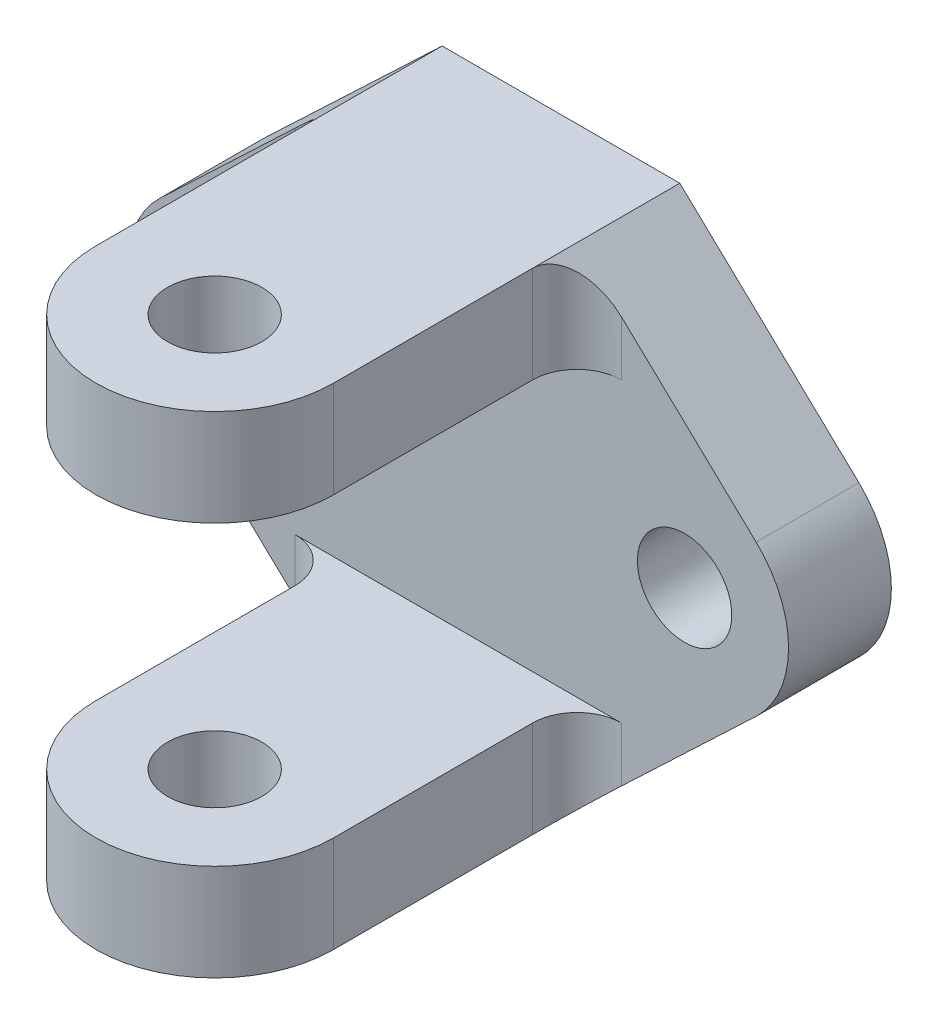
ISO-10303-21;
HEADER;
FILE_DESCRIPTION(('STEP AP214'),'2;1');
FILE_NAME('part.step','',(''),(''),'','','');
FILE_SCHEMA(('AUTOMOTIVE_DESIGN { 1 0 10303 214 1 1 1 1 }'));
ENDSEC;
DATA;
#1=APPLICATION_CONTEXT('core data for automotive mechanical design processes');
#2=APPLICATION_PROTOCOL_DEFINITION('international standard','automotive_design',2000,#1);
#3=PRODUCT_CONTEXT('',#1,'mechanical');
#4=PRODUCT('Part','Part','',(#3));
#5=PRODUCT_RELATED_PRODUCT_CATEGORY('part','',(#4));
#6=PRODUCT_DEFINITION_FORMATION('','',#4);
#7=PRODUCT_DEFINITION_CONTEXT('part definition',#1,'design');
#8=PRODUCT_DEFINITION('design','',#6,#7);
#9=PRODUCT_DEFINITION_SHAPE('','',#8);
#10=(LENGTH_UNIT() NAMED_UNIT(*) SI_UNIT(.MILLI.,.METRE.));
#11=(NAMED_UNIT(*) PLANE_ANGLE_UNIT() SI_UNIT($,.RADIAN.));
#12=(NAMED_UNIT(*) SI_UNIT($,.STERADIAN.) SOLID_ANGLE_UNIT());
#13=UNCERTAINTY_MEASURE_WITH_UNIT(LENGTH_MEASURE(1.E-05),#10,'distance_accuracy_value','');
#14=(GEOMETRIC_REPRESENTATION_CONTEXT(3) GLOBAL_UNCERTAINTY_ASSIGNED_CONTEXT((#13)) GLOBAL_UNIT_ASSIGNED_CONTEXT((#10,
#11,#12)) REPRESENTATION_CONTEXT('',''));
#15=CARTESIAN_POINT('',(0.,0.,0.));
#16=DIRECTION('',(0.,0.,1.));
#17=DIRECTION('',(1.,0.,0.));
#18=AXIS2_PLACEMENT_3D('',#15,#16,#17);
#19=CARTESIAN_POINT('',(-8.,-75.2900537937828,0.));
#20=DIRECTION('',(1.,0.,0.));
#21=DIRECTION('',(0.,0.,-1.));
#22=AXIS2_PLACEMENT_3D('',#19,#20,#21);
#23=PLANE('',#22);
#24=DIRECTION('',(0.,0.,1.));
#25=VECTOR('',#24,1.);
#26=CARTESIAN_POINT('',(-8.,16.51,0.));
#27=LINE('',#26,#25);
#28=CARTESIAN_POINT('',(-8.,16.51,12.46));
#29=VERTEX_POINT('',#28);
#30=CARTESIAN_POINT('',(-8.,16.51,25.8481308));
#31=VERTEX_POINT('',#30);
#32=EDGE_CURVE('E150',#29,#31,#27,.T.);
#33=ORIENTED_EDGE('',*,*,#32,.F.);
#34=DIRECTION('',(0.,1.,0.));
#35=VECTOR('',#34,1.);
#36=CARTESIAN_POINT('',(-8.,9.99999999999999,12.46));
#37=LINE('',#36,#35);
#38=CARTESIAN_POINT('',(-8.,10.,12.46));
#39=VERTEX_POINT('',#38);
#40=EDGE_CURVE('E143',#29,#39,#37,.F.);
#41=ORIENTED_EDGE('',*,*,#40,.T.);
#42=DIRECTION('',(0.,0.,-1.));
#43=VECTOR('',#42,1.);
#44=CARTESIAN_POINT('',(-7.99999999999999,10.,45.442));
#45=LINE('',#44,#43);
#46=CARTESIAN_POINT('',(-8.,9.99999999999999,25.8481308));
#47=VERTEX_POINT('',#46);
#48=EDGE_CURVE('E147',#47,#39,#45,.T.);
#49=ORIENTED_EDGE('',*,*,#48,.F.);
#50=DIRECTION('',(0.,1.,0.));
#51=VECTOR('',#50,1.);
#52=CARTESIAN_POINT('',(-8.,-75.2900537937828,25.8481308));
#53=LINE('',#52,#51);
#54=EDGE_CURVE('E296',#47,#31,#53,.T.);
#55=ORIENTED_EDGE('',*,*,#54,.T.);
#56=EDGE_LOOP('',(#33,#41,#49,#55));
#57=FACE_BOUND('',#56,.T.);
#58=ADVANCED_FACE('F43',(#57),#23,.F.);
#59=CARTESIAN_POINT('',(8.,-75.2900537937828,0.));
#60=DIRECTION('',(1.,0.,0.));
#61=DIRECTION('',(0.,0.,-1.));
#62=AXIS2_PLACEMENT_3D('',#59,#60,#61);
#63=PLANE('',#62);
#64=DIRECTION('',(0.,0.,-1.));
#65=VECTOR('',#64,1.);
#66=CARTESIAN_POINT('',(8.,10.,45.442));
#67=LINE('',#66,#65);
#68=CARTESIAN_POINT('',(8.,9.99999999999999,25.8481308));
#69=VERTEX_POINT('',#68);
#70=CARTESIAN_POINT('',(8.,10.,12.46));
#71=VERTEX_POINT('',#70);
#72=EDGE_CURVE('E166',#69,#71,#67,.T.);
#73=ORIENTED_EDGE('',*,*,#72,.T.);
#74=DIRECTION('',(0.,1.,0.));
#75=VECTOR('',#74,1.);
#76=CARTESIAN_POINT('',(8.,-75.2900537937828,12.46));
#77=LINE('',#76,#75);
#78=CARTESIAN_POINT('',(8.,16.51,12.46));
#79=VERTEX_POINT('',#78);
#80=EDGE_CURVE('E232',#71,#79,#77,.T.);
#81=ORIENTED_EDGE('',*,*,#80,.T.);
#82=DIRECTION('',(0.,0.,1.));
#83=VECTOR('',#82,1.);
#84=CARTESIAN_POINT('',(8.,16.51,0.));
#85=LINE('',#84,#83);
#86=CARTESIAN_POINT('',(8.,16.51,25.8481308));
#87=VERTEX_POINT('',#86);
#88=EDGE_CURVE('E293',#79,#87,#85,.T.);
#89=ORIENTED_EDGE('',*,*,#88,.T.);
#90=DIRECTION('',(0.,1.,0.));
#91=VECTOR('',#90,1.);
#92=CARTESIAN_POINT('',(8.,-75.2900537937828,25.8481308));
#93=LINE('',#92,#91);
#94=EDGE_CURVE('E309',#69,#87,#93,.T.);
#95=ORIENTED_EDGE('',*,*,#94,.F.);
#96=EDGE_LOOP('',(#73,#81,#89,#95));
#97=FACE_BOUND('',#96,.T.);
#98=ADVANCED_FACE('F376',(#97),#63,.T.);
#99=CARTESIAN_POINT('',(15.24,0.,45.8272655007219));
#100=DIRECTION('',(0.,0.,-1.));
#101=DIRECTION('',(-1.,0.,0.));
#102=AXIS2_PLACEMENT_3D('',#99,#100,#101);
#103=CYLINDRICAL_SURFACE('',#102,7.);
#104=CARTESIAN_POINT('',(15.24,0.,2.54));
#105=DIRECTION('',(0.,0.,1.));
#106=DIRECTION('',(1.,0.,0.));
#107=AXIS2_PLACEMENT_3D('',#104,#105,#106);
#108=CIRCLE('',#107,7.00000000000001);
#109=CARTESIAN_POINT('',(20.0561111284394,-5.07986944699585,2.54));
#110=VERTEX_POINT('',#109);
#111=CARTESIAN_POINT('',(20.0561111284394,5.07986944699585,2.54));
#112=VERTEX_POINT('',#111);
#113=EDGE_CURVE('E492',#110,#112,#108,.T.);
#114=ORIENTED_EDGE('',*,*,#113,.T.);
#115=DIRECTION('',(0.,0.,-1.));
#116=VECTOR('',#115,1.);
#117=CARTESIAN_POINT('',(20.0561111284394,5.07986944699585,26.0731785038264));
#118=LINE('',#117,#116);
#119=CARTESIAN_POINT('',(20.0561111284394,5.07986944699585,9.46));
#120=VERTEX_POINT('',#119);
#121=EDGE_CURVE('E209',#120,#112,#118,.T.);
#122=ORIENTED_EDGE('',*,*,#121,.F.);
#123=CARTESIAN_POINT('',(15.24,0.,9.46));
#124=DIRECTION('',(0.,0.,-1.));
#125=DIRECTION('',(-1.,0.,0.));
#126=AXIS2_PLACEMENT_3D('',#123,#124,#125);
#127=CIRCLE('',#126,7.);
#128=CARTESIAN_POINT('',(20.0561111284394,-5.07986944699585,9.46));
#129=VERTEX_POINT('',#128);
#130=EDGE_CURVE('E207',#129,#120,#127,.F.);
#131=ORIENTED_EDGE('',*,*,#130,.F.);
#132=DIRECTION('',(0.,0.,-1.));
#133=VECTOR('',#132,1.);
#134=CARTESIAN_POINT('',(20.0561111284394,-5.07986944699585,26.0731785038264));
#135=LINE('',#134,#133);
#136=EDGE_CURVE('E271',#129,#110,#135,.T.);
#137=ORIENTED_EDGE('',*,*,#136,.T.);
#138=EDGE_LOOP('',(#114,#122,#131,#137));
#139=FACE_BOUND('',#138,.T.);
#140=ADVANCED_FACE('F438',(#139),#103,.T.);
#141=DIRECTION('',(0.,0.,1.));
#142=VECTOR('',#141,1.);
#143=CARTESIAN_POINT('',(-7.99999999999999,-10.,45.442));
#144=LINE('',#143,#142);
#145=CARTESIAN_POINT('',(-8.,-10.,12.46));
#146=VERTEX_POINT('',#145);
#147=CARTESIAN_POINT('',(-8.,-10.,25.8481308));
#148=VERTEX_POINT('',#147);
#149=EDGE_CURVE('E244',#146,#148,#144,.T.);
#150=ORIENTED_EDGE('',*,*,#149,.F.);
#151=DIRECTION('',(0.,-1.,0.));
#152=VECTOR('',#151,1.);
#153=CARTESIAN_POINT('',(-8.,-16.51,12.46));
#154=LINE('',#153,#152);
#155=CARTESIAN_POINT('',(-8.,-16.51,12.46));
#156=VERTEX_POINT('',#155);
#157=EDGE_CURVE('E214',#146,#156,#154,.T.);
#158=ORIENTED_EDGE('',*,*,#157,.T.);
#159=DIRECTION('',(0.,0.,1.));
#160=VECTOR('',#159,1.);
#161=CARTESIAN_POINT('',(-8.,-16.51,0.));
#162=LINE('',#161,#160);
#163=CARTESIAN_POINT('',(-8.,-16.51,25.8481308));
#164=VERTEX_POINT('',#163);
#165=EDGE_CURVE('E304',#156,#164,#162,.T.);
#166=ORIENTED_EDGE('',*,*,#165,.T.);
#167=EDGE_CURVE('E255',#164,#148,#53,.T.);
#168=ORIENTED_EDGE('',*,*,#167,.T.);
#169=EDGE_LOOP('',(#150,#158,#166,#168));
#170=FACE_BOUND('',#169,.T.);
#171=ADVANCED_FACE('F251',(#170),#23,.F.);
#172=CARTESIAN_POINT('',(-15.24,0.,45.8272655007219));
#173=DIRECTION('',(0.,0.,-1.));
#174=DIRECTION('',(-1.,0.,0.));
#175=AXIS2_PLACEMENT_3D('',#172,#173,#174);
#176=CYLINDRICAL_SURFACE('',#175,7.);
#177=DIRECTION('',(0.,0.,-1.));
#178=VECTOR('',#177,1.);
#179=CARTESIAN_POINT('',(-20.0561111284394,5.07986944699585,26.0731785038264));
#180=LINE('',#179,#178);
#181=CARTESIAN_POINT('',(-20.0561111284394,5.07986944699585,9.46));
#182=VERTEX_POINT('',#181);
#183=CARTESIAN_POINT('',(-20.0561111284394,5.07986944699585,2.54));
#184=VERTEX_POINT('',#183);
#185=EDGE_CURVE('E210',#182,#184,#180,.T.);
#186=ORIENTED_EDGE('',*,*,#185,.T.);
#187=CARTESIAN_POINT('',(-15.24,0.,2.54));
#188=DIRECTION('',(0.,0.,1.));
#189=DIRECTION('',(1.,0.,0.));
#190=AXIS2_PLACEMENT_3D('',#187,#188,#189);
#191=CIRCLE('',#190,7.);
#192=CARTESIAN_POINT('',(-20.0561111284394,-5.07986944699585,2.54));
#193=VERTEX_POINT('',#192);
#194=EDGE_CURVE('E59',#184,#193,#191,.T.);
#195=ORIENTED_EDGE('',*,*,#194,.T.);
#196=DIRECTION('',(0.,0.,-1.));
#197=VECTOR('',#196,1.);
#198=CARTESIAN_POINT('',(-20.0561111284394,-5.07986944699585,26.0731785038264));
#199=LINE('',#198,#197);
#200=CARTESIAN_POINT('',(-20.0561111284394,-5.07986944699584,9.46));
#201=VERTEX_POINT('',#200);
#202=EDGE_CURVE('E112',#201,#193,#199,.T.);
#203=ORIENTED_EDGE('',*,*,#202,.F.);
#204=CARTESIAN_POINT('',(-15.24,0.,9.46));
#205=DIRECTION('',(0.,0.,-1.));
#206=DIRECTION('',(-1.,0.,0.));
#207=AXIS2_PLACEMENT_3D('',#204,#205,#206);
#208=CIRCLE('',#207,7.);
#209=EDGE_CURVE('E266',#201,#182,#208,.T.);
#210=ORIENTED_EDGE('',*,*,#209,.T.);
#211=EDGE_LOOP('',(#186,#195,#203,#210));
#212=FACE_BOUND('',#211,.T.);
#213=ADVANCED_FACE('F430',(#212),#176,.T.);
#214=DIRECTION('',(0.,0.,1.));
#215=VECTOR('',#214,1.);
#216=CARTESIAN_POINT('',(8.,-16.51,0.));
#217=LINE('',#216,#215);
#218=CARTESIAN_POINT('',(8.,-16.51,12.46));
#219=VERTEX_POINT('',#218);
#220=CARTESIAN_POINT('',(8.,-16.51,25.8481308));
#221=VERTEX_POINT('',#220);
#222=EDGE_CURVE('E300',#219,#221,#217,.T.);
#223=ORIENTED_EDGE('',*,*,#222,.F.);
#224=DIRECTION('',(0.,-1.,0.));
#225=VECTOR('',#224,1.);
#226=CARTESIAN_POINT('',(8.,-75.2900537937828,12.46));
#227=LINE('',#226,#225);
#228=CARTESIAN_POINT('',(8.,-9.99999999999999,12.46));
#229=VERTEX_POINT('',#228);
#230=EDGE_CURVE('E155',#219,#229,#227,.F.);
#231=ORIENTED_EDGE('',*,*,#230,.T.);
#232=DIRECTION('',(0.,0.,1.));
#233=VECTOR('',#232,1.);
#234=CARTESIAN_POINT('',(8.,-9.99999999999999,45.442));
#235=LINE('',#234,#233);
#236=CARTESIAN_POINT('',(8.,-9.99999999999999,25.8481308));
#237=VERTEX_POINT('',#236);
#238=EDGE_CURVE('E221',#229,#237,#235,.T.);
#239=ORIENTED_EDGE('',*,*,#238,.T.);
#240=EDGE_CURVE('E305',#221,#237,#93,.T.);
#241=ORIENTED_EDGE('',*,*,#240,.F.);
#242=EDGE_LOOP('',(#223,#231,#239,#241));
#243=FACE_BOUND('',#242,.T.);
#244=ADVANCED_FACE('F352',(#243),#63,.T.);
#245=CARTESIAN_POINT('',(-23.24,10.,45.442));
#246=DIRECTION('',(0.,1.,0.));
#247=DIRECTION('',(0.,0.,1.));
#248=AXIS2_PLACEMENT_3D('',#245,#246,#247);
#249=PLANE('',#248);
#250=CARTESIAN_POINT('',(0.,10.,25.8481308));
#251=DIRECTION('',(0.,1.,0.));
#252=DIRECTION('',(0.,0.,1.));
#253=AXIS2_PLACEMENT_3D('',#250,#251,#252);
#254=CIRCLE('',#253,3.175);
#255=CARTESIAN_POINT('',(0.,10.,29.0231308));
#256=VERTEX_POINT('',#255);
#257=EDGE_CURVE('E327',#256,#256,#254,.T.);
#258=ORIENTED_EDGE('',*,*,#257,.T.);
#259=EDGE_LOOP('',(#258));
#260=FACE_BOUND('',#259,.T.);
#261=ORIENTED_EDGE('',*,*,#72,.F.);
#262=CARTESIAN_POINT('',(0.,9.99999999999999,25.8481308));
#263=DIRECTION('',(0.,1.,0.));
#264=DIRECTION('',(0.,0.,1.));
#265=AXIS2_PLACEMENT_3D('',#262,#263,#264);
#266=CIRCLE('',#265,8.);
#267=EDGE_CURVE('E164',#47,#69,#266,.T.);
#268=ORIENTED_EDGE('',*,*,#267,.F.);
#269=ORIENTED_EDGE('',*,*,#48,.T.);
#270=CARTESIAN_POINT('',(-11.,10.,12.46));
#271=DIRECTION('',(0.,1.,0.));
#272=DIRECTION('',(0.,0.,1.));
#273=AXIS2_PLACEMENT_3D('',#270,#271,#272);
#274=CIRCLE('',#273,3.);
#275=CARTESIAN_POINT('',(-11.,10.,9.46));
#276=VERTEX_POINT('',#275);
#277=EDGE_CURVE('E161',#39,#276,#274,.T.);
#278=ORIENTED_EDGE('',*,*,#277,.T.);
#279=DIRECTION('',(1.,0.,0.));
#280=VECTOR('',#279,1.);
#281=CARTESIAN_POINT('',(-23.24,10.,9.46));
#282=LINE('',#281,#280);
#283=CARTESIAN_POINT('',(11.,10.,9.46));
#284=VERTEX_POINT('',#283);
#285=EDGE_CURVE('E333',#276,#284,#282,.T.);
#286=ORIENTED_EDGE('',*,*,#285,.T.);
#287=CARTESIAN_POINT('',(11.,9.99999999999999,12.46));
#288=DIRECTION('',(0.,1.,0.));
#289=DIRECTION('',(0.,0.,1.));
#290=AXIS2_PLACEMENT_3D('',#287,#288,#289);
#291=CIRCLE('',#290,3.);
#292=EDGE_CURVE('E11',#284,#71,#291,.T.);
#293=ORIENTED_EDGE('',*,*,#292,.T.);
#294=EDGE_LOOP('',(#261,#268,#269,#278,#286,#293));
#295=FACE_BOUND('',#294,.T.);
#296=ADVANCED_FACE('F160',(#260,#295),#249,.F.);
#297=CARTESIAN_POINT('',(-23.24,-10.,45.442));
#298=DIRECTION('',(0.,-1.,0.));
#299=DIRECTION('',(1.,0.,0.));
#300=AXIS2_PLACEMENT_3D('',#297,#298,#299);
#301=PLANE('',#300);
#302=CARTESIAN_POINT('',(0.,-9.99999999999999,25.8481308));
#303=DIRECTION('',(0.,-1.,0.));
#304=DIRECTION('',(1.,0.,0.));
#305=AXIS2_PLACEMENT_3D('',#302,#303,#304);
#306=CIRCLE('',#305,3.175);
#307=CARTESIAN_POINT('',(0.,-9.99999999999999,29.0231308));
#308=VERTEX_POINT('',#307);
#309=EDGE_CURVE('E326',#308,#308,#306,.T.);
#310=ORIENTED_EDGE('',*,*,#309,.T.);
#311=EDGE_LOOP('',(#310));
#312=FACE_BOUND('',#311,.T.);
#313=ORIENTED_EDGE('',*,*,#238,.F.);
#314=CARTESIAN_POINT('',(11.,-9.99999999999999,12.46));
#315=DIRECTION('',(0.,-1.,0.));
#316=DIRECTION('',(1.,0.,0.));
#317=AXIS2_PLACEMENT_3D('',#314,#315,#316);
#318=CIRCLE('',#317,3.);
#319=CARTESIAN_POINT('',(11.,-9.99999999999999,9.46));
#320=VERTEX_POINT('',#319);
#321=EDGE_CURVE('E178',#229,#320,#318,.T.);
#322=ORIENTED_EDGE('',*,*,#321,.T.);
#323=DIRECTION('',(-1.,0.,0.));
#324=VECTOR('',#323,1.);
#325=CARTESIAN_POINT('',(-23.24,-10.,9.46));
#326=LINE('',#325,#324);
#327=CARTESIAN_POINT('',(-11.,-10.,9.46));
#328=VERTEX_POINT('',#327);
#329=EDGE_CURVE('E246',#320,#328,#326,.T.);
#330=ORIENTED_EDGE('',*,*,#329,.T.);
#331=CARTESIAN_POINT('',(-11.,-9.99999999999999,12.46));
#332=DIRECTION('',(0.,-1.,0.));
#333=DIRECTION('',(1.,0.,0.));
#334=AXIS2_PLACEMENT_3D('',#331,#332,#333);
#335=CIRCLE('',#334,3.);
#336=EDGE_CURVE('E180',#328,#146,#335,.T.);
#337=ORIENTED_EDGE('',*,*,#336,.T.);
#338=ORIENTED_EDGE('',*,*,#149,.T.);
#339=CARTESIAN_POINT('',(0.,-9.99999999999998,25.8481308));
#340=DIRECTION('',(0.,-1.,0.));
#341=DIRECTION('',(1.,0.,0.));
#342=AXIS2_PLACEMENT_3D('',#339,#340,#341);
#343=CIRCLE('',#342,8.);
#344=EDGE_CURVE('E258',#237,#148,#343,.T.);
#345=ORIENTED_EDGE('',*,*,#344,.F.);
#346=EDGE_LOOP('',(#313,#322,#330,#337,#338,#345));
#347=FACE_BOUND('',#346,.T.);
#348=ADVANCED_FACE('F242',(#312,#347),#301,.F.);
#349=CARTESIAN_POINT('',(0.,0.,9.46));
#350=DIRECTION('',(0.,0.,-1.));
#351=DIRECTION('',(-1.,0.,0.));
#352=AXIS2_PLACEMENT_3D('',#349,#350,#351);
#353=PLANE('',#352);
#354=DIRECTION('',(0.725695635285122,-0.688015875491346,0.));
#355=VECTOR('',#354,1.);
#356=CARTESIAN_POINT('',(-12.030206605144,-12.6890508430442,9.46));
#357=LINE('',#356,#355);
#358=CARTESIAN_POINT('',(-11.,-13.6657667896637,9.46));
#359=VERTEX_POINT('',#358);
#360=EDGE_CURVE('E264',#201,#359,#357,.T.);
#361=ORIENTED_EDGE('',*,*,#360,.T.);
#362=DIRECTION('',(0.,-1.,0.));
#363=VECTOR('',#362,1.);
#364=CARTESIAN_POINT('',(-11.,-9.99999999999999,9.46));
#365=LINE('',#364,#363);
#366=EDGE_CURVE('E156',#359,#328,#365,.F.);
#367=ORIENTED_EDGE('',*,*,#366,.T.);
#368=ORIENTED_EDGE('',*,*,#329,.F.);
#369=DIRECTION('',(0.,-1.,0.));
#370=VECTOR('',#369,1.);
#371=CARTESIAN_POINT('',(11.,0.,9.46));
#372=LINE('',#371,#370);
#373=CARTESIAN_POINT('',(11.,-13.6657667896637,9.46));
#374=VERTEX_POINT('',#373);
#375=EDGE_CURVE('E213',#320,#374,#372,.T.);
#376=ORIENTED_EDGE('',*,*,#375,.T.);
#377=DIRECTION('',(-0.725695635285122,-0.688015875491346,0.));
#378=VECTOR('',#377,1.);
#379=CARTESIAN_POINT('',(12.030206605144,-12.6890508430442,9.46));
#380=LINE('',#379,#378);
#381=EDGE_CURVE('E275',#129,#374,#380,.T.);
#382=ORIENTED_EDGE('',*,*,#381,.F.);
#383=ORIENTED_EDGE('',*,*,#130,.T.);
#384=DIRECTION('',(-0.725695635285122,0.688015875491346,0.));
#385=VECTOR('',#384,1.);
#386=CARTESIAN_POINT('',(8.,16.51,9.46));
#387=LINE('',#386,#385);
#388=CARTESIAN_POINT('',(11.,13.6657667896637,9.46));
#389=VERTEX_POINT('',#388);
#390=EDGE_CURVE('E192',#120,#389,#387,.T.);
#391=ORIENTED_EDGE('',*,*,#390,.T.);
#392=DIRECTION('',(0.,1.,0.));
#393=VECTOR('',#392,1.);
#394=CARTESIAN_POINT('',(11.,0.,9.46));
#395=LINE('',#394,#393);
#396=EDGE_CURVE('E204',#389,#284,#395,.F.);
#397=ORIENTED_EDGE('',*,*,#396,.T.);
#398=ORIENTED_EDGE('',*,*,#285,.F.);
#399=DIRECTION('',(0.,1.,0.));
#400=VECTOR('',#399,1.);
#401=CARTESIAN_POINT('',(-11.,16.51,9.46));
#402=LINE('',#401,#400);
#403=CARTESIAN_POINT('',(-11.,13.6657667896637,9.46));
#404=VERTEX_POINT('',#403);
#405=EDGE_CURVE('E170',#276,#404,#402,.T.);
#406=ORIENTED_EDGE('',*,*,#405,.T.);
#407=DIRECTION('',(0.725695635285122,0.688015875491346,0.));
#408=VECTOR('',#407,1.);
#409=CARTESIAN_POINT('',(-8.,16.51,9.46));
#410=LINE('',#409,#408);
#411=EDGE_CURVE('E424',#182,#404,#410,.T.);
#412=ORIENTED_EDGE('',*,*,#411,.F.);
#413=ORIENTED_EDGE('',*,*,#209,.F.);
#414=EDGE_LOOP('',(#361,#367,#368,#376,#382,#383,#391,#397,#398,#406,#412,#413));
#415=FACE_BOUND('',#414,.T.);
#416=CARTESIAN_POINT('',(15.24,0.,9.46));
#417=DIRECTION('',(0.,0.,1.));
#418=DIRECTION('',(1.,0.,0.));
#419=AXIS2_PLACEMENT_3D('',#416,#417,#418);
#420=CIRCLE('',#419,3.175);
#421=CARTESIAN_POINT('',(18.415,0.,9.46));
#422=VERTEX_POINT('',#421);
#423=EDGE_CURVE('E259',#422,#422,#420,.T.);
#424=ORIENTED_EDGE('',*,*,#423,.F.);
#425=EDGE_LOOP('',(#424));
#426=FACE_BOUND('',#425,.T.);
#427=CARTESIAN_POINT('',(-15.24,0.,9.46));
#428=DIRECTION('',(0.,0.,1.));
#429=DIRECTION('',(1.,0.,0.));
#430=AXIS2_PLACEMENT_3D('',#427,#428,#429);
#431=CIRCLE('',#430,3.175);
#432=CARTESIAN_POINT('',(-12.065,0.,9.46));
#433=VERTEX_POINT('',#432);
#434=EDGE_CURVE('E336',#433,#433,#431,.T.);
#435=ORIENTED_EDGE('',*,*,#434,.F.);
#436=EDGE_LOOP('',(#435));
#437=FACE_BOUND('',#436,.T.);
#438=ADVANCED_FACE('F202',(#415,#426,#437),#353,.F.);
#439=CARTESIAN_POINT('',(-23.24,16.51,9.46));
#440=DIRECTION('',(0.,-1.,0.));
#441=DIRECTION('',(0.,0.,-1.));
#442=AXIS2_PLACEMENT_3D('',#439,#440,#441);
#443=PLANE('',#442);
#444=CARTESIAN_POINT('',(0.,16.51,25.8481308));
#445=DIRECTION('',(0.,-1.,0.));
#446=DIRECTION('',(0.,0.,-1.));
#447=AXIS2_PLACEMENT_3D('',#444,#445,#446);
#448=CIRCLE('',#447,3.175);
#449=CARTESIAN_POINT('',(0.,16.51,29.0231308));
#450=VERTEX_POINT('',#449);
#451=EDGE_CURVE('E318',#450,#450,#448,.T.);
#452=ORIENTED_EDGE('',*,*,#451,.T.);
#453=EDGE_LOOP('',(#452));
#454=FACE_BOUND('',#453,.T.);
#455=CARTESIAN_POINT('',(8.,16.51,2.54));
#456=VERTEX_POINT('',#455);
#457=EDGE_CURVE('E80',#456,#79,#85,.T.);
#458=ORIENTED_EDGE('',*,*,#457,.F.);
#459=DIRECTION('',(-1.,0.,0.));
#460=VECTOR('',#459,1.);
#461=CARTESIAN_POINT('',(8.,16.51,2.54));
#462=LINE('',#461,#460);
#463=CARTESIAN_POINT('',(-8.,16.51,2.54));
#464=VERTEX_POINT('',#463);
#465=EDGE_CURVE('E414',#456,#464,#462,.T.);
#466=ORIENTED_EDGE('',*,*,#465,.T.);
#467=EDGE_CURVE('E286',#464,#29,#27,.T.);
#468=ORIENTED_EDGE('',*,*,#467,.T.);
#469=ORIENTED_EDGE('',*,*,#32,.T.);
#470=CARTESIAN_POINT('',(0.,16.51,25.8481308));
#471=DIRECTION('',(0.,-1.,0.));
#472=DIRECTION('',(0.,0.,-1.));
#473=AXIS2_PLACEMENT_3D('',#470,#471,#472);
#474=CIRCLE('',#473,8.);
#475=EDGE_CURVE('E289',#87,#31,#474,.T.);
#476=ORIENTED_EDGE('',*,*,#475,.F.);
#477=ORIENTED_EDGE('',*,*,#88,.F.);
#478=EDGE_LOOP('',(#458,#466,#468,#469,#476,#477));
#479=FACE_BOUND('',#478,.T.);
#480=ADVANCED_FACE('F384',(#454,#479),#443,.F.);
#481=CARTESIAN_POINT('',(-23.24,-16.51,9.46));
#482=DIRECTION('',(0.,1.,0.));
#483=DIRECTION('',(0.,0.,1.));
#484=AXIS2_PLACEMENT_3D('',#481,#482,#483);
#485=PLANE('',#484);
#486=CARTESIAN_POINT('',(-8.,-16.51,2.54));
#487=VERTEX_POINT('',#486);
#488=EDGE_CURVE('E101',#487,#156,#162,.T.);
#489=ORIENTED_EDGE('',*,*,#488,.F.);
#490=DIRECTION('',(1.,0.,0.));
#491=VECTOR('',#490,1.);
#492=CARTESIAN_POINT('',(-8.,-16.51,2.54));
#493=LINE('',#492,#491);
#494=CARTESIAN_POINT('',(8.,-16.51,2.54));
#495=VERTEX_POINT('',#494);
#496=EDGE_CURVE('E755',#487,#495,#493,.T.);
#497=ORIENTED_EDGE('',*,*,#496,.T.);
#498=EDGE_CURVE('E68',#495,#219,#217,.T.);
#499=ORIENTED_EDGE('',*,*,#498,.T.);
#500=ORIENTED_EDGE('',*,*,#222,.T.);
#501=CARTESIAN_POINT('',(0.,-16.51,25.8481308));
#502=DIRECTION('',(0.,1.,0.));
#503=DIRECTION('',(0.,0.,1.));
#504=AXIS2_PLACEMENT_3D('',#501,#502,#503);
#505=CIRCLE('',#504,8.);
#506=EDGE_CURVE('E299',#221,#164,#505,.F.);
#507=ORIENTED_EDGE('',*,*,#506,.T.);
#508=ORIENTED_EDGE('',*,*,#165,.F.);
#509=EDGE_LOOP('',(#489,#497,#499,#500,#507,#508));
#510=FACE_BOUND('',#509,.T.);
#511=CARTESIAN_POINT('',(0.,-16.51,25.8481308));
#512=DIRECTION('',(0.,1.,0.));
#513=DIRECTION('',(0.,0.,1.));
#514=AXIS2_PLACEMENT_3D('',#511,#512,#513);
#515=CIRCLE('',#514,3.175);
#516=CARTESIAN_POINT('',(0.,-16.51,29.0231308));
#517=VERTEX_POINT('',#516);
#518=EDGE_CURVE('E322',#517,#517,#515,.F.);
#519=ORIENTED_EDGE('',*,*,#518,.F.);
#520=EDGE_LOOP('',(#519));
#521=FACE_BOUND('',#520,.T.);
#522=ADVANCED_FACE('F363',(#510,#521),#485,.F.);
#523=CARTESIAN_POINT('',(15.24,0.,9.46));
#524=DIRECTION('',(0.,0.,-1.));
#525=DIRECTION('',(-1.,0.,0.));
#526=AXIS2_PLACEMENT_3D('',#523,#524,#525);
#527=CYLINDRICAL_SURFACE('',#526,3.175);
#528=CARTESIAN_POINT('',(15.24,0.,2.54));
#529=DIRECTION('',(0.,0.,1.));
#530=DIRECTION('',(1.,0.,0.));
#531=AXIS2_PLACEMENT_3D('',#528,#529,#530);
#532=CIRCLE('',#531,3.175);
#533=CARTESIAN_POINT('',(18.415,0.,2.54));
#534=VERTEX_POINT('',#533);
#535=EDGE_CURVE('E426',#534,#534,#532,.T.);
#536=ORIENTED_EDGE('',*,*,#535,.F.);
#537=EDGE_LOOP('',(#536));
#538=FACE_BOUND('',#537,.T.);
#539=ORIENTED_EDGE('',*,*,#423,.T.);
#540=EDGE_LOOP('',(#539));
#541=FACE_BOUND('',#540,.T.);
#542=ADVANCED_FACE('F464',(#538,#541),#527,.F.);
#543=CARTESIAN_POINT('',(-15.24,0.,9.46));
#544=DIRECTION('',(0.,0.,-1.));
#545=DIRECTION('',(-1.,0.,0.));
#546=AXIS2_PLACEMENT_3D('',#543,#544,#545);
#547=CYLINDRICAL_SURFACE('',#546,3.175);
#548=CARTESIAN_POINT('',(-15.24,0.,2.54));
#549=DIRECTION('',(0.,0.,1.));
#550=DIRECTION('',(1.,0.,0.));
#551=AXIS2_PLACEMENT_3D('',#548,#549,#550);
#552=CIRCLE('',#551,3.175);
#553=CARTESIAN_POINT('',(-12.065,0.,2.54));
#554=VERTEX_POINT('',#553);
#555=EDGE_CURVE('E495',#554,#554,#552,.T.);
#556=ORIENTED_EDGE('',*,*,#555,.F.);
#557=EDGE_LOOP('',(#556));
#558=FACE_BOUND('',#557,.T.);
#559=ORIENTED_EDGE('',*,*,#434,.T.);
#560=EDGE_LOOP('',(#559));
#561=FACE_BOUND('',#560,.T.);
#562=ADVANCED_FACE('F461',(#558,#561),#547,.F.);
#563=CARTESIAN_POINT('',(0.,-25.4902561210691,25.8481308));
#564=DIRECTION('',(0.,1.,0.));
#565=DIRECTION('',(0.,0.,1.));
#566=AXIS2_PLACEMENT_3D('',#563,#564,#565);
#567=CYLINDRICAL_SURFACE('',#566,3.175);
#568=CARTESIAN_POINT('',(0.,-16.51,29.0231308));
#569=CARTESIAN_POINT('',(0.,-16.4421875,29.0231308));
#570=CARTESIAN_POINT('',(0.,-16.374375,29.0231308));
#571=CARTESIAN_POINT('',(0.,-16.23875,29.0231308));
#572=CARTESIAN_POINT('',(0.,-16.1709375,29.0231308));
#573=CARTESIAN_POINT('',(0.,-16.0353125,29.0231308));
#574=CARTESIAN_POINT('',(0.,-15.9675,29.0231308));
#575=CARTESIAN_POINT('',(0.,-15.831875,29.0231308));
#576=CARTESIAN_POINT('',(0.,-15.7640625,29.0231308));
#577=CARTESIAN_POINT('',(0.,-15.6284375,29.0231308));
#578=CARTESIAN_POINT('',(0.,-15.560625,29.0231308));
#579=CARTESIAN_POINT('',(0.,-15.425,29.0231308));
#580=CARTESIAN_POINT('',(0.,-15.3571875,29.0231308));
#581=CARTESIAN_POINT('',(0.,-15.2215625,29.0231308));
#582=CARTESIAN_POINT('',(0.,-15.15375,29.0231308));
#583=CARTESIAN_POINT('',(0.,-15.018125,29.0231308));
#584=CARTESIAN_POINT('',(0.,-14.9503125,29.0231308));
#585=CARTESIAN_POINT('',(0.,-14.8146875,29.0231308));
#586=CARTESIAN_POINT('',(0.,-14.746875,29.0231308));
#587=CARTESIAN_POINT('',(0.,-14.61125,29.0231308));
#588=CARTESIAN_POINT('',(0.,-14.5434375,29.0231308));
#589=CARTESIAN_POINT('',(0.,-14.4078125,29.0231308));
#590=CARTESIAN_POINT('',(0.,-14.34,29.0231308));
#591=CARTESIAN_POINT('',(0.,-14.204375,29.0231308));
#592=CARTESIAN_POINT('',(0.,-14.1365625,29.0231308));
#593=CARTESIAN_POINT('',(0.,-14.0009375,29.0231308));
#594=CARTESIAN_POINT('',(0.,-13.933125,29.0231308));
#595=CARTESIAN_POINT('',(0.,-13.7975,29.0231308));
#596=CARTESIAN_POINT('',(0.,-13.7296875,29.0231308));
#597=CARTESIAN_POINT('',(0.,-13.5940625,29.0231308));
#598=CARTESIAN_POINT('',(0.,-13.52625,29.0231308));
#599=CARTESIAN_POINT('',(0.,-13.390625,29.0231308));
#600=CARTESIAN_POINT('',(0.,-13.3228125,29.0231308));
#601=CARTESIAN_POINT('',(0.,-13.1871875,29.0231308));
#602=CARTESIAN_POINT('',(0.,-13.119375,29.0231308));
#603=CARTESIAN_POINT('',(0.,-12.98375,29.0231308));
#604=CARTESIAN_POINT('',(0.,-12.9159375,29.0231308));
#605=CARTESIAN_POINT('',(0.,-12.7803125,29.0231308));
#606=CARTESIAN_POINT('',(0.,-12.7125,29.0231308));
#607=CARTESIAN_POINT('',(0.,-12.576875,29.0231308));
#608=CARTESIAN_POINT('',(0.,-12.5090625,29.0231308));
#609=CARTESIAN_POINT('',(0.,-12.3734375,29.0231308));
#610=CARTESIAN_POINT('',(0.,-12.305625,29.0231308));
#611=CARTESIAN_POINT('',(0.,-12.17,29.0231308));
#612=CARTESIAN_POINT('',(0.,-12.1021875,29.0231308));
#613=CARTESIAN_POINT('',(0.,-11.9665625,29.0231308));
#614=CARTESIAN_POINT('',(0.,-11.89875,29.0231308));
#615=CARTESIAN_POINT('',(0.,-11.763125,29.0231308));
#616=CARTESIAN_POINT('',(0.,-11.6953125,29.0231308));
#617=CARTESIAN_POINT('',(0.,-11.5596875,29.0231308));
#618=CARTESIAN_POINT('',(0.,-11.491875,29.0231308));
#619=CARTESIAN_POINT('',(0.,-11.35625,29.0231308));
#620=CARTESIAN_POINT('',(0.,-11.2884375,29.0231308));
#621=CARTESIAN_POINT('',(0.,-11.1528125,29.0231308));
#622=CARTESIAN_POINT('',(0.,-11.085,29.0231308));
#623=CARTESIAN_POINT('',(0.,-10.949375,29.0231308));
#624=CARTESIAN_POINT('',(0.,-10.8815625,29.0231308));
#625=CARTESIAN_POINT('',(0.,-10.7459375,29.0231308));
#626=CARTESIAN_POINT('',(0.,-10.678125,29.0231308));
#627=CARTESIAN_POINT('',(0.,-10.5425,29.0231308));
#628=CARTESIAN_POINT('',(0.,-10.4746875,29.0231308));
#629=CARTESIAN_POINT('',(0.,-10.3390625,29.0231308));
#630=CARTESIAN_POINT('',(0.,-10.27125,29.0231308));
#631=CARTESIAN_POINT('',(0.,-10.135625,29.0231308));
#632=CARTESIAN_POINT('',(0.,-10.0678125,29.0231308));
#633=CARTESIAN_POINT('',(0.,-9.99999999999999,29.0231308));
#634=B_SPLINE_CURVE_WITH_KNOTS('',3,(#568,#569,#570,#571,#572,#573,#574,#575,#576,#577,#578,
#579,#580,#581,#582,#583,#584,#585,#586,#587,#588,#589,#590,#591,#592,#593,#594,#595,#596,#597,
#598,#599,#600,#601,#602,#603,#604,#605,#606,#607,#608,#609,#610,#611,#612,#613,#614,#615,#616,
#617,#618,#619,#620,#621,#622,#623,#624,#625,#626,#627,#628,#629,#630,#631,#632,#633),
.UNSPECIFIED.,.F.,.F.,(4,2,2,2,2,2,2,2,2,2,2,2,2,2,2,2,2,2,2,2,2,2,2,2,2,2,2,2,2,2,2,2,4),(0.,
0.2034375,0.406875000000001,0.610312500000001,0.813750000000002,1.0171875,1.220625,1.4240625,
1.6275,1.8309375,2.03437500000001,2.2378125,2.44125,2.6446875,2.84812500000001,3.05156250000001,
3.25500000000001,3.45843750000001,3.66187500000001,3.86531250000001,4.06875000000001,
4.27218750000001,4.47562500000001,4.67906250000001,4.88250000000001,5.08593750000001,
5.28937500000001,5.49281250000001,5.69625000000001,5.89968750000001,6.10312500000001,
6.30656250000001,6.51000000000001),.UNSPECIFIED.);
#635=EDGE_CURVE('BSEAM453',#517,#308,#634,.T.);
#636=ORIENTED_EDGE('',*,*,#518,.T.);
#637=ORIENTED_EDGE('',*,*,#309,.F.);
#638=ORIENTED_EDGE('',*,*,#635,.T.);
#639=ORIENTED_EDGE('',*,*,#635,.F.);
#640=EDGE_LOOP('',(#636,#638,#637,#639));
#641=FACE_BOUND('',#640,.T.);
#642=ADVANCED_FACE('F453',(#641),#567,.F.);
#643=CARTESIAN_POINT('',(0.,16.51,29.0231308));
#644=CARTESIAN_POINT('',(0.,16.4421875,29.0231308));
#645=CARTESIAN_POINT('',(0.,16.374375,29.0231308));
#646=CARTESIAN_POINT('',(0.,16.23875,29.0231308));
#647=CARTESIAN_POINT('',(0.,16.1709375,29.0231308));
#648=CARTESIAN_POINT('',(0.,16.0353125,29.0231308));
#649=CARTESIAN_POINT('',(0.,15.9675,29.0231308));
#650=CARTESIAN_POINT('',(0.,15.831875,29.0231308));
#651=CARTESIAN_POINT('',(0.,15.7640625,29.0231308));
#652=CARTESIAN_POINT('',(0.,15.6284375,29.0231308));
#653=CARTESIAN_POINT('',(0.,15.560625,29.0231308));
#654=CARTESIAN_POINT('',(0.,15.425,29.0231308));
#655=CARTESIAN_POINT('',(0.,15.3571875,29.0231308));
#656=CARTESIAN_POINT('',(0.,15.2215625,29.0231308));
#657=CARTESIAN_POINT('',(0.,15.15375,29.0231308));
#658=CARTESIAN_POINT('',(0.,15.018125,29.0231308));
#659=CARTESIAN_POINT('',(0.,14.9503125,29.0231308));
#660=CARTESIAN_POINT('',(0.,14.8146875,29.0231308));
#661=CARTESIAN_POINT('',(0.,14.746875,29.0231308));
#662=CARTESIAN_POINT('',(0.,14.61125,29.0231308));
#663=CARTESIAN_POINT('',(0.,14.5434375,29.0231308));
#664=CARTESIAN_POINT('',(0.,14.4078125,29.0231308));
#665=CARTESIAN_POINT('',(0.,14.34,29.0231308));
#666=CARTESIAN_POINT('',(0.,14.204375,29.0231308));
#667=CARTESIAN_POINT('',(0.,14.1365625,29.0231308));
#668=CARTESIAN_POINT('',(0.,14.0009375,29.0231308));
#669=CARTESIAN_POINT('',(0.,13.933125,29.0231308));
#670=CARTESIAN_POINT('',(0.,13.7975,29.0231308));
#671=CARTESIAN_POINT('',(0.,13.7296875,29.0231308));
#672=CARTESIAN_POINT('',(0.,13.5940625,29.0231308));
#673=CARTESIAN_POINT('',(0.,13.52625,29.0231308));
#674=CARTESIAN_POINT('',(0.,13.390625,29.0231308));
#675=CARTESIAN_POINT('',(0.,13.3228125,29.0231308));
#676=CARTESIAN_POINT('',(0.,13.1871875,29.0231308));
#677=CARTESIAN_POINT('',(0.,13.119375,29.0231308));
#678=CARTESIAN_POINT('',(0.,12.98375,29.0231308));
#679=CARTESIAN_POINT('',(0.,12.9159375,29.0231308));
#680=CARTESIAN_POINT('',(0.,12.7803125,29.0231308));
#681=CARTESIAN_POINT('',(0.,12.7125,29.0231308));
#682=CARTESIAN_POINT('',(0.,12.576875,29.0231308));
#683=CARTESIAN_POINT('',(0.,12.5090625,29.0231308));
#684=CARTESIAN_POINT('',(0.,12.3734375,29.0231308));
#685=CARTESIAN_POINT('',(0.,12.305625,29.0231308));
#686=CARTESIAN_POINT('',(0.,12.17,29.0231308));
#687=CARTESIAN_POINT('',(0.,12.1021875,29.0231308));
#688=CARTESIAN_POINT('',(0.,11.9665625,29.0231308));
#689=CARTESIAN_POINT('',(0.,11.89875,29.0231308));
#690=CARTESIAN_POINT('',(0.,11.763125,29.0231308));
#691=CARTESIAN_POINT('',(0.,11.6953125,29.0231308));
#692=CARTESIAN_POINT('',(0.,11.5596875,29.0231308));
#693=CARTESIAN_POINT('',(0.,11.491875,29.0231308));
#694=CARTESIAN_POINT('',(0.,11.35625,29.0231308));
#695=CARTESIAN_POINT('',(0.,11.2884375,29.0231308));
#696=CARTESIAN_POINT('',(0.,11.1528125,29.0231308));
#697=CARTESIAN_POINT('',(0.,11.085,29.0231308));
#698=CARTESIAN_POINT('',(0.,10.949375,29.0231308));
#699=CARTESIAN_POINT('',(0.,10.8815625,29.0231308));
#700=CARTESIAN_POINT('',(0.,10.7459375,29.0231308));
#701=CARTESIAN_POINT('',(0.,10.678125,29.0231308));
#702=CARTESIAN_POINT('',(0.,10.5425,29.0231308));
#703=CARTESIAN_POINT('',(0.,10.4746875,29.0231308));
#704=CARTESIAN_POINT('',(0.,10.3390625,29.0231308));
#705=CARTESIAN_POINT('',(0.,10.27125,29.0231308));
#706=CARTESIAN_POINT('',(0.,10.135625,29.0231308));
#707=CARTESIAN_POINT('',(0.,10.0678125,29.0231308));
#708=CARTESIAN_POINT('',(0.,10.,29.0231308));
#709=B_SPLINE_CURVE_WITH_KNOTS('',3,(#643,#644,#645,#646,#647,#648,#649,#650,#651,#652,#653,
#654,#655,#656,#657,#658,#659,#660,#661,#662,#663,#664,#665,#666,#667,#668,#669,#670,#671,#672,
#673,#674,#675,#676,#677,#678,#679,#680,#681,#682,#683,#684,#685,#686,#687,#688,#689,#690,#691,
#692,#693,#694,#695,#696,#697,#698,#699,#700,#701,#702,#703,#704,#705,#706,#707,#708),
.UNSPECIFIED.,.F.,.F.,(4,2,2,2,2,2,2,2,2,2,2,2,2,2,2,2,2,2,2,2,2,2,2,2,2,2,2,2,2,2,2,2,4),(0.,
0.2034375,0.406875000000001,0.610312500000001,0.813750000000002,1.0171875,1.220625,1.4240625,
1.6275,1.8309375,2.034375,2.2378125,2.44125,2.6446875,2.848125,3.0515625,3.255,3.4584375,
3.661875,3.8653125,4.06875,4.2721875,4.475625,4.6790625,4.8825,5.0859375,5.289375,5.4928125,
5.69625,5.8996875,6.103125,6.3065625,6.51),.UNSPECIFIED.);
#710=EDGE_CURVE('BSEAM450',#450,#256,#709,.T.);
#711=ORIENTED_EDGE('',*,*,#451,.F.);
#712=ORIENTED_EDGE('',*,*,#257,.F.);
#713=ORIENTED_EDGE('',*,*,#710,.T.);
#714=ORIENTED_EDGE('',*,*,#710,.F.);
#715=EDGE_LOOP('',(#711,#713,#712,#714));
#716=FACE_BOUND('',#715,.T.);
#717=ADVANCED_FACE('F450',(#716),#567,.F.);
#718=CARTESIAN_POINT('',(0.,-75.2900537937828,25.8481308));
#719=DIRECTION('',(0.,1.,0.));
#720=DIRECTION('',(0.,0.,1.));
#721=AXIS2_PLACEMENT_3D('',#718,#719,#720);
#722=CYLINDRICAL_SURFACE('',#721,8.);
#723=ORIENTED_EDGE('',*,*,#344,.T.);
#724=ORIENTED_EDGE('',*,*,#167,.F.);
#725=ORIENTED_EDGE('',*,*,#506,.F.);
#726=ORIENTED_EDGE('',*,*,#240,.T.);
#727=EDGE_LOOP('',(#723,#724,#725,#726));
#728=FACE_BOUND('',#727,.T.);
#729=ADVANCED_FACE('F359',(#728),#722,.T.);
#730=ORIENTED_EDGE('',*,*,#267,.T.);
#731=ORIENTED_EDGE('',*,*,#94,.T.);
#732=ORIENTED_EDGE('',*,*,#475,.T.);
#733=ORIENTED_EDGE('',*,*,#54,.F.);
#734=EDGE_LOOP('',(#730,#731,#732,#733));
#735=FACE_BOUND('',#734,.T.);
#736=ADVANCED_FACE('F371',(#735),#722,.T.);
#737=CARTESIAN_POINT('',(12.030206605144,-12.6890508430442,26.0731785038264));
#738=DIRECTION('',(-0.688015875491346,0.725695635285121,0.));
#739=DIRECTION('',(-0.725695635285122,-0.688015875491346,0.));
#740=AXIS2_PLACEMENT_3D('',#737,#738,#739);
#741=PLANE('',#740);
#742=ORIENTED_EDGE('',*,*,#498,.F.);
#743=DIRECTION('',(0.725695635285121,0.688015875491346,0.));
#744=VECTOR('',#743,1.);
#745=CARTESIAN_POINT('',(8.,-16.51,2.54));
#746=LINE('',#745,#744);
#747=EDGE_CURVE('E489',#495,#110,#746,.T.);
#748=ORIENTED_EDGE('',*,*,#747,.T.);
#749=ORIENTED_EDGE('',*,*,#136,.F.);
#750=ORIENTED_EDGE('',*,*,#381,.T.);
#751=CARTESIAN_POINT('',(11.,-13.6657667896637,12.46));
#752=DIRECTION('',(-0.688015875491346,0.725695635285121,0.));
#753=DIRECTION('',(-0.725695635285122,-0.688015875491346,0.));
#754=AXIS2_PLACEMENT_3D('',#751,#752,#753);
#755=ELLIPSE('',#754,4.13396450816645,3.);
#756=EDGE_CURVE('E172',#374,#219,#755,.T.);
#757=ORIENTED_EDGE('',*,*,#756,.T.);
#758=EDGE_LOOP('',(#742,#748,#749,#750,#757));
#759=FACE_BOUND('',#758,.T.);
#760=ADVANCED_FACE('F449',(#759),#741,.F.);
#761=CARTESIAN_POINT('',(-12.030206605144,-12.6890508430442,26.0731785038264));
#762=DIRECTION('',(-0.688015875491346,-0.725695635285122,0.));
#763=DIRECTION('',(0.725695635285122,-0.688015875491346,0.));
#764=AXIS2_PLACEMENT_3D('',#761,#762,#763);
#765=PLANE('',#764);
#766=DIRECTION('',(0.725695635285121,-0.688015875491347,0.));
#767=VECTOR('',#766,1.);
#768=CARTESIAN_POINT('',(-20.0561111284394,-5.07986944699585,2.54));
#769=LINE('',#768,#767);
#770=EDGE_CURVE('E758',#193,#487,#769,.T.);
#771=ORIENTED_EDGE('',*,*,#770,.T.);
#772=ORIENTED_EDGE('',*,*,#488,.T.);
#773=CARTESIAN_POINT('',(-11.,-13.6657667896637,12.46));
#774=DIRECTION('',(-0.688015875491346,-0.725695635285122,0.));
#775=DIRECTION('',(-0.725695635285122,0.688015875491346,0.));
#776=AXIS2_PLACEMENT_3D('',#773,#774,#775);
#777=ELLIPSE('',#776,4.13396450816645,3.);
#778=EDGE_CURVE('E235',#156,#359,#777,.F.);
#779=ORIENTED_EDGE('',*,*,#778,.T.);
#780=ORIENTED_EDGE('',*,*,#360,.F.);
#781=ORIENTED_EDGE('',*,*,#202,.T.);
#782=EDGE_LOOP('',(#771,#772,#779,#780,#781));
#783=FACE_BOUND('',#782,.T.);
#784=ADVANCED_FACE('F263',(#783),#765,.T.);
#785=CARTESIAN_POINT('',(8.,16.51,26.0731785038264));
#786=DIRECTION('',(0.688015875491346,0.725695635285122,0.));
#787=DIRECTION('',(-0.725695635285122,0.688015875491346,0.));
#788=AXIS2_PLACEMENT_3D('',#785,#786,#787);
#789=PLANE('',#788);
#790=DIRECTION('',(-0.725695635285122,0.688015875491346,0.));
#791=VECTOR('',#790,1.);
#792=CARTESIAN_POINT('',(20.0561111284394,5.07986944699585,2.54));
#793=LINE('',#792,#791);
#794=EDGE_CURVE('E493',#112,#456,#793,.T.);
#795=ORIENTED_EDGE('',*,*,#794,.T.);
#796=ORIENTED_EDGE('',*,*,#457,.T.);
#797=CARTESIAN_POINT('',(11.,13.6657667896637,12.46));
#798=DIRECTION('',(0.688015875491346,0.725695635285122,0.));
#799=DIRECTION('',(-0.725695635285122,0.688015875491346,0.));
#800=AXIS2_PLACEMENT_3D('',#797,#798,#799);
#801=ELLIPSE('',#800,4.13396450816645,3.);
#802=EDGE_CURVE('E52',#79,#389,#801,.F.);
#803=ORIENTED_EDGE('',*,*,#802,.T.);
#804=ORIENTED_EDGE('',*,*,#390,.F.);
#805=ORIENTED_EDGE('',*,*,#121,.T.);
#806=EDGE_LOOP('',(#795,#796,#803,#804,#805));
#807=FACE_BOUND('',#806,.T.);
#808=ADVANCED_FACE('F189',(#807),#789,.T.);
#809=CARTESIAN_POINT('',(-8.,16.51,26.0731785038264));
#810=DIRECTION('',(0.688015875491346,-0.725695635285122,0.));
#811=DIRECTION('',(0.725695635285122,0.688015875491346,0.));
#812=AXIS2_PLACEMENT_3D('',#809,#810,#811);
#813=PLANE('',#812);
#814=ORIENTED_EDGE('',*,*,#467,.F.);
#815=DIRECTION('',(-0.725695635285122,-0.688015875491346,0.));
#816=VECTOR('',#815,1.);
#817=CARTESIAN_POINT('',(-8.,16.51,2.54));
#818=LINE('',#817,#816);
#819=EDGE_CURVE('E412',#464,#184,#818,.T.);
#820=ORIENTED_EDGE('',*,*,#819,.T.);
#821=ORIENTED_EDGE('',*,*,#185,.F.);
#822=ORIENTED_EDGE('',*,*,#411,.T.);
#823=CARTESIAN_POINT('',(-11.,13.6657667896637,12.46));
#824=DIRECTION('',(0.688015875491346,-0.725695635285122,0.));
#825=DIRECTION('',(-0.725695635285122,-0.688015875491346,0.));
#826=AXIS2_PLACEMENT_3D('',#823,#824,#825);
#827=ELLIPSE('',#826,4.13396450816645,3.);
#828=EDGE_CURVE('E173',#404,#29,#827,.T.);
#829=ORIENTED_EDGE('',*,*,#828,.T.);
#830=EDGE_LOOP('',(#814,#820,#821,#822,#829));
#831=FACE_BOUND('',#830,.T.);
#832=ADVANCED_FACE('F422',(#831),#813,.F.);
#833=CARTESIAN_POINT('',(-11.,-75.2900537937828,12.46));
#834=DIRECTION('',(0.,1.,0.));
#835=DIRECTION('',(0.,0.,1.));
#836=AXIS2_PLACEMENT_3D('',#833,#834,#835);
#837=CYLINDRICAL_SURFACE('',#836,3.);
#838=ORIENTED_EDGE('',*,*,#336,.F.);
#839=ORIENTED_EDGE('',*,*,#366,.F.);
#840=ORIENTED_EDGE('',*,*,#778,.F.);
#841=ORIENTED_EDGE('',*,*,#157,.F.);
#842=EDGE_LOOP('',(#838,#839,#840,#841));
#843=FACE_BOUND('',#842,.T.);
#844=ADVANCED_FACE('F261',(#843),#837,.F.);
#845=CARTESIAN_POINT('',(-11.,0.,12.46));
#846=DIRECTION('',(0.,-1.,0.));
#847=DIRECTION('',(0.,0.,-1.));
#848=AXIS2_PLACEMENT_3D('',#845,#846,#847);
#849=CYLINDRICAL_SURFACE('',#848,3.);
#850=ORIENTED_EDGE('',*,*,#277,.F.);
#851=ORIENTED_EDGE('',*,*,#40,.F.);
#852=ORIENTED_EDGE('',*,*,#828,.F.);
#853=ORIENTED_EDGE('',*,*,#405,.F.);
#854=EDGE_LOOP('',(#850,#851,#852,#853));
#855=FACE_BOUND('',#854,.T.);
#856=ADVANCED_FACE('F168',(#855),#849,.F.);
#857=CARTESIAN_POINT('',(11.,0.,12.46));
#858=DIRECTION('',(0.,-1.,0.));
#859=DIRECTION('',(0.,0.,-1.));
#860=AXIS2_PLACEMENT_3D('',#857,#858,#859);
#861=CYLINDRICAL_SURFACE('',#860,3.);
#862=ORIENTED_EDGE('',*,*,#321,.F.);
#863=ORIENTED_EDGE('',*,*,#230,.F.);
#864=ORIENTED_EDGE('',*,*,#756,.F.);
#865=ORIENTED_EDGE('',*,*,#375,.F.);
#866=EDGE_LOOP('',(#862,#863,#864,#865));
#867=FACE_BOUND('',#866,.T.);
#868=ADVANCED_FACE('F479',(#867),#861,.F.);
#869=CARTESIAN_POINT('',(11.,-75.2900537937828,12.46));
#870=DIRECTION('',(0.,1.,0.));
#871=DIRECTION('',(0.,0.,1.));
#872=AXIS2_PLACEMENT_3D('',#869,#870,#871);
#873=CYLINDRICAL_SURFACE('',#872,3.);
#874=ORIENTED_EDGE('',*,*,#292,.F.);
#875=ORIENTED_EDGE('',*,*,#396,.F.);
#876=ORIENTED_EDGE('',*,*,#802,.F.);
#877=ORIENTED_EDGE('',*,*,#80,.F.);
#878=EDGE_LOOP('',(#874,#875,#876,#877));
#879=FACE_BOUND('',#878,.T.);
#880=ADVANCED_FACE('F45',(#879),#873,.F.);
#881=CARTESIAN_POINT('',(-15.24,0.,2.54));
#882=DIRECTION('',(0.,0.,1.));
#883=DIRECTION('',(1.,0.,0.));
#884=AXIS2_PLACEMENT_3D('',#881,#882,#883);
#885=PLANE('',#884);
#886=ORIENTED_EDGE('',*,*,#535,.T.);
#887=EDGE_LOOP('',(#886));
#888=FACE_BOUND('',#887,.T.);
#889=ORIENTED_EDGE('',*,*,#555,.T.);
#890=EDGE_LOOP('',(#889));
#891=FACE_BOUND('',#890,.T.);
#892=ORIENTED_EDGE('',*,*,#465,.F.);
#893=ORIENTED_EDGE('',*,*,#794,.F.);
#894=ORIENTED_EDGE('',*,*,#113,.F.);
#895=ORIENTED_EDGE('',*,*,#747,.F.);
#896=ORIENTED_EDGE('',*,*,#496,.F.);
#897=ORIENTED_EDGE('',*,*,#770,.F.);
#898=ORIENTED_EDGE('',*,*,#194,.F.);
#899=ORIENTED_EDGE('',*,*,#819,.F.);
#900=EDGE_LOOP('',(#892,#893,#894,#895,#896,#897,#898,#899));
#901=FACE_BOUND('',#900,.T.);
#902=ADVANCED_FACE('F413',(#888,#891,#901),#885,.F.);
#903=CLOSED_SHELL('',(#58,#98,#140,#171,#213,#244,#296,#348,#438,#480,#522,#542,#562,#642,#717,
#729,#736,#760,#784,#808,#832,#844,#856,#868,#880,#902));
#904=MANIFOLD_SOLID_BREP('B2',#903);
#905=ADVANCED_BREP_SHAPE_REPRESENTATION('',(#18,#904),#14);
#906=SHAPE_DEFINITION_REPRESENTATION(#9,#905);
ENDSEC;
END-ISO-10303-21;
